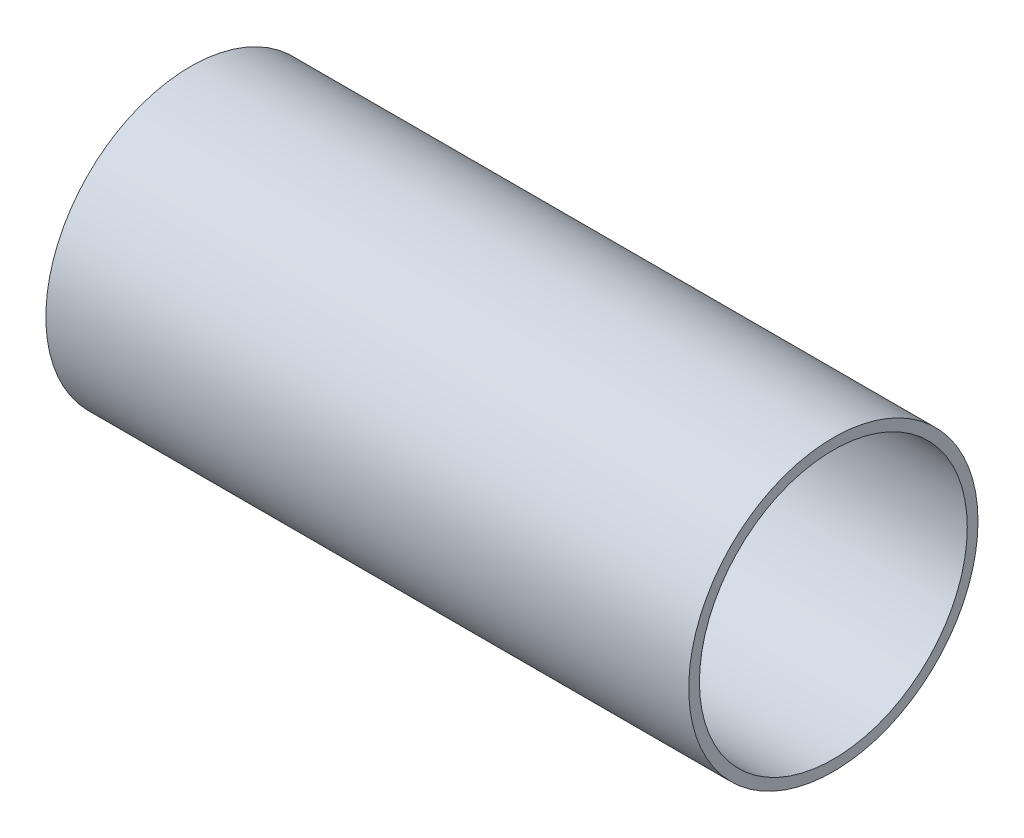
ISO-10303-21;
HEADER;
FILE_DESCRIPTION(('STEP AP214'),'2;1');
FILE_NAME('part.step','',(''),(''),'','','');
FILE_SCHEMA(('AUTOMOTIVE_DESIGN { 1 0 10303 214 1 1 1 1 }'));
ENDSEC;
DATA;
#1=APPLICATION_CONTEXT('core data for automotive mechanical design processes');
#2=APPLICATION_PROTOCOL_DEFINITION('international standard','automotive_design',2000,#1);
#3=PRODUCT_CONTEXT('',#1,'mechanical');
#4=PRODUCT('Part','Part','',(#3));
#5=PRODUCT_RELATED_PRODUCT_CATEGORY('part','',(#4));
#6=PRODUCT_DEFINITION_FORMATION('','',#4);
#7=PRODUCT_DEFINITION_CONTEXT('part definition',#1,'design');
#8=PRODUCT_DEFINITION('design','',#6,#7);
#9=PRODUCT_DEFINITION_SHAPE('','',#8);
#10=(LENGTH_UNIT() NAMED_UNIT(*) SI_UNIT(.MILLI.,.METRE.));
#11=(NAMED_UNIT(*) PLANE_ANGLE_UNIT() SI_UNIT($,.RADIAN.));
#12=(NAMED_UNIT(*) SI_UNIT($,.STERADIAN.) SOLID_ANGLE_UNIT());
#13=UNCERTAINTY_MEASURE_WITH_UNIT(LENGTH_MEASURE(1.E-05),#10,'distance_accuracy_value','');
#14=(GEOMETRIC_REPRESENTATION_CONTEXT(3) GLOBAL_UNCERTAINTY_ASSIGNED_CONTEXT((#13)) GLOBAL_UNIT_ASSIGNED_CONTEXT((#10,
#11,#12)) REPRESENTATION_CONTEXT('',''));
#15=CARTESIAN_POINT('',(0.,0.,0.));
#16=DIRECTION('',(0.,0.,1.));
#17=DIRECTION('',(1.,0.,0.));
#18=AXIS2_PLACEMENT_3D('',#15,#16,#17);
#19=CARTESIAN_POINT('',(0.,0.,0.));
#20=DIRECTION('',(-1.,0.,0.));
#21=DIRECTION('',(0.,0.,1.));
#22=AXIS2_PLACEMENT_3D('',#19,#20,#21);
#23=CYLINDRICAL_SURFACE('',#22,34.29);
#24=CARTESIAN_POINT('',(-152.4,0.,0.));
#25=DIRECTION('',(1.,0.,0.));
#26=DIRECTION('',(0.,0.,-1.));
#27=AXIS2_PLACEMENT_3D('',#24,#25,#26);
#28=CIRCLE('',#27,34.29);
#29=CARTESIAN_POINT('',(-152.4,0.,-34.29));
#30=VERTEX_POINT('',#29);
#31=EDGE_CURVE('E51',#30,#30,#28,.T.);
#32=ORIENTED_EDGE('',*,*,#31,.T.);
#33=EDGE_LOOP('',(#32));
#34=FACE_BOUND('',#33,.T.);
#35=CARTESIAN_POINT('',(0.,0.,0.));
#36=DIRECTION('',(1.,0.,0.));
#37=DIRECTION('',(0.,0.,-1.));
#38=AXIS2_PLACEMENT_3D('',#35,#36,#37);
#39=CIRCLE('',#38,34.29);
#40=CARTESIAN_POINT('',(0.,0.,-34.29));
#41=VERTEX_POINT('',#40);
#42=EDGE_CURVE('E40',#41,#41,#39,.T.);
#43=ORIENTED_EDGE('',*,*,#42,.F.);
#44=EDGE_LOOP('',(#43));
#45=FACE_BOUND('',#44,.T.);
#46=ADVANCED_FACE('F37',(#34,#45),#23,.T.);
#47=CARTESIAN_POINT('',(0.,0.,0.));
#48=DIRECTION('',(1.,0.,0.));
#49=DIRECTION('',(0.,0.,-1.));
#50=AXIS2_PLACEMENT_3D('',#47,#48,#49);
#51=PLANE('',#50);
#52=CARTESIAN_POINT('',(0.,0.,0.));
#53=DIRECTION('',(1.,0.,0.));
#54=DIRECTION('',(0.,0.,-1.));
#55=AXIS2_PLACEMENT_3D('',#52,#53,#54);
#56=CIRCLE('',#55,31.75);
#57=CARTESIAN_POINT('',(0.,0.,-31.75));
#58=VERTEX_POINT('',#57);
#59=EDGE_CURVE('E45',#58,#58,#56,.F.);
#60=ORIENTED_EDGE('',*,*,#59,.T.);
#61=EDGE_LOOP('',(#60));
#62=FACE_BOUND('',#61,.T.);
#63=ORIENTED_EDGE('',*,*,#42,.T.);
#64=EDGE_LOOP('',(#63));
#65=FACE_BOUND('',#64,.T.);
#66=ADVANCED_FACE('F61',(#62,#65),#51,.T.);
#67=CARTESIAN_POINT('',(-152.4,0.,0.));
#68=DIRECTION('',(1.,0.,0.));
#69=DIRECTION('',(0.,0.,-1.));
#70=AXIS2_PLACEMENT_3D('',#67,#68,#69);
#71=PLANE('',#70);
#72=CARTESIAN_POINT('',(-152.4,0.,0.));
#73=DIRECTION('',(1.,0.,0.));
#74=DIRECTION('',(0.,0.,-1.));
#75=AXIS2_PLACEMENT_3D('',#72,#73,#74);
#76=CIRCLE('',#75,31.75);
#77=CARTESIAN_POINT('',(-152.4,0.,-31.75));
#78=VERTEX_POINT('',#77);
#79=EDGE_CURVE('E10',#78,#78,#76,.F.);
#80=ORIENTED_EDGE('',*,*,#79,.F.);
#81=EDGE_LOOP('',(#80));
#82=FACE_BOUND('',#81,.T.);
#83=ORIENTED_EDGE('',*,*,#31,.F.);
#84=EDGE_LOOP('',(#83));
#85=FACE_BOUND('',#84,.T.);
#86=ADVANCED_FACE('F67',(#82,#85),#71,.F.);
#87=CARTESIAN_POINT('',(0.,0.,0.));
#88=DIRECTION('',(-1.,0.,0.));
#89=DIRECTION('',(0.,0.,1.));
#90=AXIS2_PLACEMENT_3D('',#87,#88,#89);
#91=CYLINDRICAL_SURFACE('',#90,31.75);
#92=ORIENTED_EDGE('',*,*,#79,.T.);
#93=EDGE_LOOP('',(#92));
#94=FACE_BOUND('',#93,.T.);
#95=ORIENTED_EDGE('',*,*,#59,.F.);
#96=EDGE_LOOP('',(#95));
#97=FACE_BOUND('',#96,.T.);
#98=ADVANCED_FACE('F69',(#94,#97),#91,.F.);
#99=CLOSED_SHELL('',(#46,#66,#86,#98));
#100=MANIFOLD_SOLID_BREP('B2',#99);
#101=ADVANCED_BREP_SHAPE_REPRESENTATION('',(#18,#100),#14);
#102=SHAPE_DEFINITION_REPRESENTATION(#9,#101);
ENDSEC;
END-ISO-10303-21;
